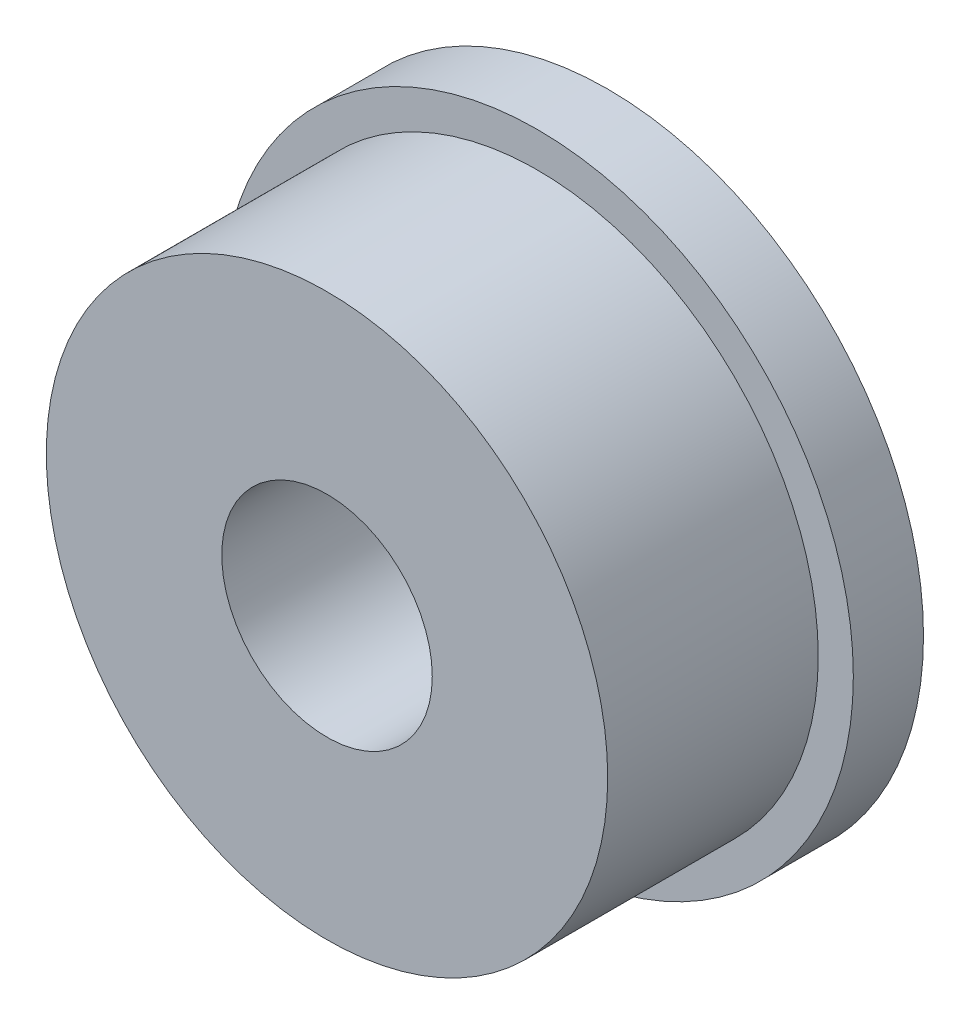
ISO-10303-21;
HEADER;
FILE_DESCRIPTION(('STEP AP214'),'2;1');
FILE_NAME('part.step','',(''),(''),'','','');
FILE_SCHEMA(('AUTOMOTIVE_DESIGN { 1 0 10303 214 1 1 1 1 }'));
ENDSEC;
DATA;
#1=APPLICATION_CONTEXT('core data for automotive mechanical design processes');
#2=APPLICATION_PROTOCOL_DEFINITION('international standard','automotive_design',2000,#1);
#3=PRODUCT_CONTEXT('',#1,'mechanical');
#4=PRODUCT('Part','Part','',(#3));
#5=PRODUCT_RELATED_PRODUCT_CATEGORY('part','',(#4));
#6=PRODUCT_DEFINITION_FORMATION('','',#4);
#7=PRODUCT_DEFINITION_CONTEXT('part definition',#1,'design');
#8=PRODUCT_DEFINITION('design','',#6,#7);
#9=PRODUCT_DEFINITION_SHAPE('','',#8);
#10=(LENGTH_UNIT() NAMED_UNIT(*) SI_UNIT(.MILLI.,.METRE.));
#11=(NAMED_UNIT(*) PLANE_ANGLE_UNIT() SI_UNIT($,.RADIAN.));
#12=(NAMED_UNIT(*) SI_UNIT($,.STERADIAN.) SOLID_ANGLE_UNIT());
#13=UNCERTAINTY_MEASURE_WITH_UNIT(LENGTH_MEASURE(1.E-05),#10,'distance_accuracy_value','');
#14=(GEOMETRIC_REPRESENTATION_CONTEXT(3) GLOBAL_UNCERTAINTY_ASSIGNED_CONTEXT((#13)) GLOBAL_UNIT_ASSIGNED_CONTEXT((#10,
#11,#12)) REPRESENTATION_CONTEXT('',''));
#15=CARTESIAN_POINT('',(0.,0.,0.));
#16=DIRECTION('',(0.,0.,1.));
#17=DIRECTION('',(1.,0.,0.));
#18=AXIS2_PLACEMENT_3D('',#15,#16,#17);
#19=CARTESIAN_POINT('',(0.,0.,1.));
#20=DIRECTION('',(0.,0.,-1.));
#21=DIRECTION('',(-1.,0.,0.));
#22=AXIS2_PLACEMENT_3D('',#19,#20,#21);
#23=CYLINDRICAL_SURFACE('',#22,4.5);
#24=CARTESIAN_POINT('',(0.,0.,1.));
#25=DIRECTION('',(0.,0.,1.));
#26=DIRECTION('',(1.,0.,0.));
#27=AXIS2_PLACEMENT_3D('',#24,#25,#26);
#28=CIRCLE('',#27,4.5);
#29=CARTESIAN_POINT('',(4.5,0.,1.));
#30=VERTEX_POINT('',#29);
#31=EDGE_CURVE('E41',#30,#30,#28,.T.);
#32=ORIENTED_EDGE('',*,*,#31,.F.);
#33=EDGE_LOOP('',(#32));
#34=FACE_BOUND('',#33,.T.);
#35=CARTESIAN_POINT('',(0.,0.,0.));
#36=DIRECTION('',(0.,0.,1.));
#37=DIRECTION('',(1.,0.,0.));
#38=AXIS2_PLACEMENT_3D('',#35,#36,#37);
#39=CIRCLE('',#38,4.5);
#40=CARTESIAN_POINT('',(4.5,0.,0.));
#41=VERTEX_POINT('',#40);
#42=EDGE_CURVE('E37',#41,#41,#39,.T.);
#43=ORIENTED_EDGE('',*,*,#42,.T.);
#44=EDGE_LOOP('',(#43));
#45=FACE_BOUND('',#44,.T.);
#46=ADVANCED_FACE('F34',(#34,#45),#23,.T.);
#47=CARTESIAN_POINT('',(0.,0.,1.));
#48=DIRECTION('',(0.,0.,1.));
#49=DIRECTION('',(1.,0.,0.));
#50=AXIS2_PLACEMENT_3D('',#47,#48,#49);
#51=PLANE('',#50);
#52=CARTESIAN_POINT('',(0.,0.,1.));
#53=DIRECTION('',(0.,0.,1.));
#54=DIRECTION('',(1.,0.,0.));
#55=AXIS2_PLACEMENT_3D('',#52,#53,#54);
#56=CIRCLE('',#55,4.);
#57=CARTESIAN_POINT('',(4.,0.,1.));
#58=VERTEX_POINT('',#57);
#59=EDGE_CURVE('E10',#58,#58,#56,.T.);
#60=ORIENTED_EDGE('',*,*,#59,.F.);
#61=EDGE_LOOP('',(#60));
#62=FACE_BOUND('',#61,.T.);
#63=ORIENTED_EDGE('',*,*,#31,.T.);
#64=EDGE_LOOP('',(#63));
#65=FACE_BOUND('',#64,.T.);
#66=ADVANCED_FACE('F78',(#62,#65),#51,.T.);
#67=CARTESIAN_POINT('',(0.,0.,0.));
#68=DIRECTION('',(0.,0.,1.));
#69=DIRECTION('',(1.,0.,0.));
#70=AXIS2_PLACEMENT_3D('',#67,#68,#69);
#71=PLANE('',#70);
#72=CARTESIAN_POINT('',(0.,0.,0.));
#73=DIRECTION('',(0.,0.,1.));
#74=DIRECTION('',(1.,0.,0.));
#75=AXIS2_PLACEMENT_3D('',#72,#73,#74);
#76=CIRCLE('',#75,1.5);
#77=CARTESIAN_POINT('',(1.5,0.,0.));
#78=VERTEX_POINT('',#77);
#79=EDGE_CURVE('E50',#78,#78,#76,.T.);
#80=ORIENTED_EDGE('',*,*,#79,.T.);
#81=EDGE_LOOP('',(#80));
#82=FACE_BOUND('',#81,.T.);
#83=ORIENTED_EDGE('',*,*,#42,.F.);
#84=EDGE_LOOP('',(#83));
#85=FACE_BOUND('',#84,.T.);
#86=ADVANCED_FACE('F57',(#82,#85),#71,.F.);
#87=CARTESIAN_POINT('',(0.,0.,4.));
#88=DIRECTION('',(0.,0.,-1.));
#89=DIRECTION('',(-1.,0.,0.));
#90=AXIS2_PLACEMENT_3D('',#87,#88,#89);
#91=CYLINDRICAL_SURFACE('',#90,4.);
#92=CARTESIAN_POINT('',(0.,0.,4.));
#93=DIRECTION('',(0.,0.,1.));
#94=DIRECTION('',(1.,0.,0.));
#95=AXIS2_PLACEMENT_3D('',#92,#93,#94);
#96=CIRCLE('',#95,4.);
#97=CARTESIAN_POINT('',(4.,0.,4.));
#98=VERTEX_POINT('',#97);
#99=EDGE_CURVE('E47',#98,#98,#96,.T.);
#100=ORIENTED_EDGE('',*,*,#99,.F.);
#101=EDGE_LOOP('',(#100));
#102=FACE_BOUND('',#101,.T.);
#103=ORIENTED_EDGE('',*,*,#59,.T.);
#104=EDGE_LOOP('',(#103));
#105=FACE_BOUND('',#104,.T.);
#106=ADVANCED_FACE('F69',(#102,#105),#91,.T.);
#107=CARTESIAN_POINT('',(0.,0.,4.));
#108=DIRECTION('',(0.,0.,1.));
#109=DIRECTION('',(1.,0.,0.));
#110=AXIS2_PLACEMENT_3D('',#107,#108,#109);
#111=PLANE('',#110);
#112=CARTESIAN_POINT('',(0.,0.,4.));
#113=DIRECTION('',(0.,0.,1.));
#114=DIRECTION('',(1.,0.,0.));
#115=AXIS2_PLACEMENT_3D('',#112,#113,#114);
#116=CIRCLE('',#115,1.5);
#117=CARTESIAN_POINT('',(1.5,0.,4.));
#118=VERTEX_POINT('',#117);
#119=EDGE_CURVE('E51',#118,#118,#116,.T.);
#120=ORIENTED_EDGE('',*,*,#119,.F.);
#121=EDGE_LOOP('',(#120));
#122=FACE_BOUND('',#121,.T.);
#123=ORIENTED_EDGE('',*,*,#99,.T.);
#124=EDGE_LOOP('',(#123));
#125=FACE_BOUND('',#124,.T.);
#126=ADVANCED_FACE('F63',(#122,#125),#111,.T.);
#127=CARTESIAN_POINT('',(0.,0.,0.));
#128=DIRECTION('',(0.,0.,1.));
#129=DIRECTION('',(1.,0.,0.));
#130=AXIS2_PLACEMENT_3D('',#127,#128,#129);
#131=CYLINDRICAL_SURFACE('',#130,1.5);
#132=ORIENTED_EDGE('',*,*,#79,.F.);
#133=EDGE_LOOP('',(#132));
#134=FACE_BOUND('',#133,.T.);
#135=ORIENTED_EDGE('',*,*,#119,.T.);
#136=EDGE_LOOP('',(#135));
#137=FACE_BOUND('',#136,.T.);
#138=ADVANCED_FACE('F60',(#134,#137),#131,.F.);
#139=CLOSED_SHELL('',(#46,#66,#86,#106,#126,#138));
#140=MANIFOLD_SOLID_BREP('B2',#139);
#141=ADVANCED_BREP_SHAPE_REPRESENTATION('',(#18,#140),#14);
#142=SHAPE_DEFINITION_REPRESENTATION(#9,#141);
ENDSEC;
END-ISO-10303-21;
